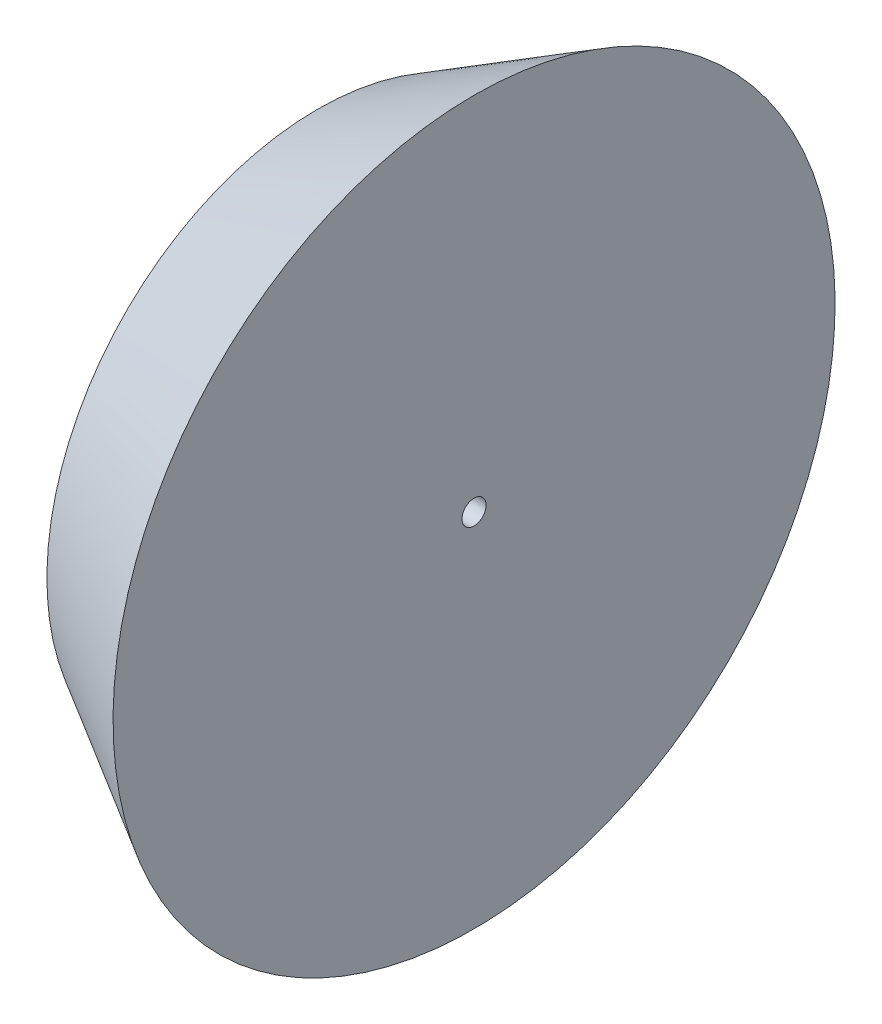
ISO-10303-21;
HEADER;
FILE_DESCRIPTION(('STEP AP214'),'2;1');
FILE_NAME('part.step','',(''),(''),'','','');
FILE_SCHEMA(('AUTOMOTIVE_DESIGN { 1 0 10303 214 1 1 1 1 }'));
ENDSEC;
DATA;
#1=APPLICATION_CONTEXT('core data for automotive mechanical design processes');
#2=APPLICATION_PROTOCOL_DEFINITION('international standard','automotive_design',2000,#1);
#3=PRODUCT_CONTEXT('',#1,'mechanical');
#4=PRODUCT('Part','Part','',(#3));
#5=PRODUCT_RELATED_PRODUCT_CATEGORY('part','',(#4));
#6=PRODUCT_DEFINITION_FORMATION('','',#4);
#7=PRODUCT_DEFINITION_CONTEXT('part definition',#1,'design');
#8=PRODUCT_DEFINITION('design','',#6,#7);
#9=PRODUCT_DEFINITION_SHAPE('','',#8);
#10=(LENGTH_UNIT() NAMED_UNIT(*) SI_UNIT(.MILLI.,.METRE.));
#11=(NAMED_UNIT(*) PLANE_ANGLE_UNIT() SI_UNIT($,.RADIAN.));
#12=(NAMED_UNIT(*) SI_UNIT($,.STERADIAN.) SOLID_ANGLE_UNIT());
#13=UNCERTAINTY_MEASURE_WITH_UNIT(LENGTH_MEASURE(1.E-05),#10,'distance_accuracy_value','');
#14=(GEOMETRIC_REPRESENTATION_CONTEXT(3) GLOBAL_UNCERTAINTY_ASSIGNED_CONTEXT((#13)) GLOBAL_UNIT_ASSIGNED_CONTEXT((#10,
#11,#12)) REPRESENTATION_CONTEXT('',''));
#15=CARTESIAN_POINT('',(0.,0.,0.));
#16=DIRECTION('',(0.,0.,1.));
#17=DIRECTION('',(1.,0.,0.));
#18=AXIS2_PLACEMENT_3D('',#15,#16,#17);
#19=CARTESIAN_POINT('',(0.,0.,0.));
#20=DIRECTION('',(-1.,0.,0.));
#21=DIRECTION('',(0.,-1.,0.));
#22=AXIS2_PLACEMENT_3D('',#19,#20,#21);
#23=PLANE('',#22);
#24=CARTESIAN_POINT('',(0.,0.,0.));
#25=DIRECTION('',(-1.,0.,0.));
#26=DIRECTION('',(0.,-1.,0.));
#27=AXIS2_PLACEMENT_3D('',#24,#25,#26);
#28=CIRCLE('',#27,6.35);
#29=CARTESIAN_POINT('',(0.,-6.35,0.));
#30=VERTEX_POINT('',#29);
#31=EDGE_CURVE('E53',#30,#30,#28,.T.);
#32=ORIENTED_EDGE('',*,*,#31,.F.);
#33=EDGE_LOOP('',(#32));
#34=FACE_BOUND('',#33,.T.);
#35=CARTESIAN_POINT('',(0.,0.,0.));
#36=DIRECTION('',(1.,0.,0.));
#37=DIRECTION('',(0.,1.,0.));
#38=AXIS2_PLACEMENT_3D('',#35,#36,#37);
#39=CIRCLE('',#38,142.839735278397);
#40=CARTESIAN_POINT('',(0.,142.839735278397,0.));
#41=VERTEX_POINT('',#40);
#42=EDGE_CURVE('E10',#41,#41,#39,.T.);
#43=ORIENTED_EDGE('',*,*,#42,.F.);
#44=EDGE_LOOP('',(#43));
#45=FACE_BOUND('',#44,.T.);
#46=ADVANCED_FACE('F36',(#34,#45),#23,.T.);
#47=CARTESIAN_POINT('',(82.5499999999999,0.,0.));
#48=DIRECTION('',(1.,0.,0.));
#49=DIRECTION('',(0.,1.,0.));
#50=AXIS2_PLACEMENT_3D('',#47,#48,#49);
#51=CONICAL_SURFACE('',#50,190.5,0.523598775598293);
#52=ORIENTED_EDGE('',*,*,#42,.T.);
#53=EDGE_LOOP('',(#52));
#54=FACE_BOUND('',#53,.T.);
#55=CARTESIAN_POINT('',(82.5499999999999,0.,0.));
#56=DIRECTION('',(1.,0.,0.));
#57=DIRECTION('',(0.,1.,0.));
#58=AXIS2_PLACEMENT_3D('',#55,#56,#57);
#59=CIRCLE('',#58,190.5);
#60=CARTESIAN_POINT('',(82.5499999999999,190.5,0.));
#61=VERTEX_POINT('',#60);
#62=EDGE_CURVE('E43',#61,#61,#59,.T.);
#63=ORIENTED_EDGE('',*,*,#62,.F.);
#64=EDGE_LOOP('',(#63));
#65=FACE_BOUND('',#64,.T.);
#66=ADVANCED_FACE('F65',(#54,#65),#51,.T.);
#67=CARTESIAN_POINT('',(82.5499999999999,190.5,0.));
#68=DIRECTION('',(1.,0.,0.));
#69=DIRECTION('',(0.,1.,0.));
#70=AXIS2_PLACEMENT_3D('',#67,#68,#69);
#71=PLANE('',#70);
#72=CARTESIAN_POINT('',(82.55,0.,0.));
#73=DIRECTION('',(1.,0.,0.));
#74=DIRECTION('',(0.,1.,0.));
#75=AXIS2_PLACEMENT_3D('',#72,#73,#74);
#76=CIRCLE('',#75,6.35);
#77=CARTESIAN_POINT('',(82.55,6.35000000000001,0.));
#78=VERTEX_POINT('',#77);
#79=EDGE_CURVE('E48',#78,#78,#76,.F.);
#80=ORIENTED_EDGE('',*,*,#79,.T.);
#81=EDGE_LOOP('',(#80));
#82=FACE_BOUND('',#81,.T.);
#83=ORIENTED_EDGE('',*,*,#62,.T.);
#84=EDGE_LOOP('',(#83));
#85=FACE_BOUND('',#84,.T.);
#86=ADVANCED_FACE('F71',(#82,#85),#71,.T.);
#87=CARTESIAN_POINT('',(100.510512242138,0.,0.));
#88=DIRECTION('',(-1.,0.,0.));
#89=DIRECTION('',(0.,-1.,0.));
#90=AXIS2_PLACEMENT_3D('',#87,#88,#89);
#91=CYLINDRICAL_SURFACE('',#90,6.35);
#92=ORIENTED_EDGE('',*,*,#31,.T.);
#93=EDGE_LOOP('',(#92));
#94=FACE_BOUND('',#93,.T.);
#95=ORIENTED_EDGE('',*,*,#79,.F.);
#96=EDGE_LOOP('',(#95));
#97=FACE_BOUND('',#96,.T.);
#98=ADVANCED_FACE('F60',(#94,#97),#91,.F.);
#99=CLOSED_SHELL('',(#46,#66,#86,#98));
#100=MANIFOLD_SOLID_BREP('B2',#99);
#101=ADVANCED_BREP_SHAPE_REPRESENTATION('',(#18,#100),#14);
#102=SHAPE_DEFINITION_REPRESENTATION(#9,#101);
ENDSEC;
END-ISO-10303-21;
